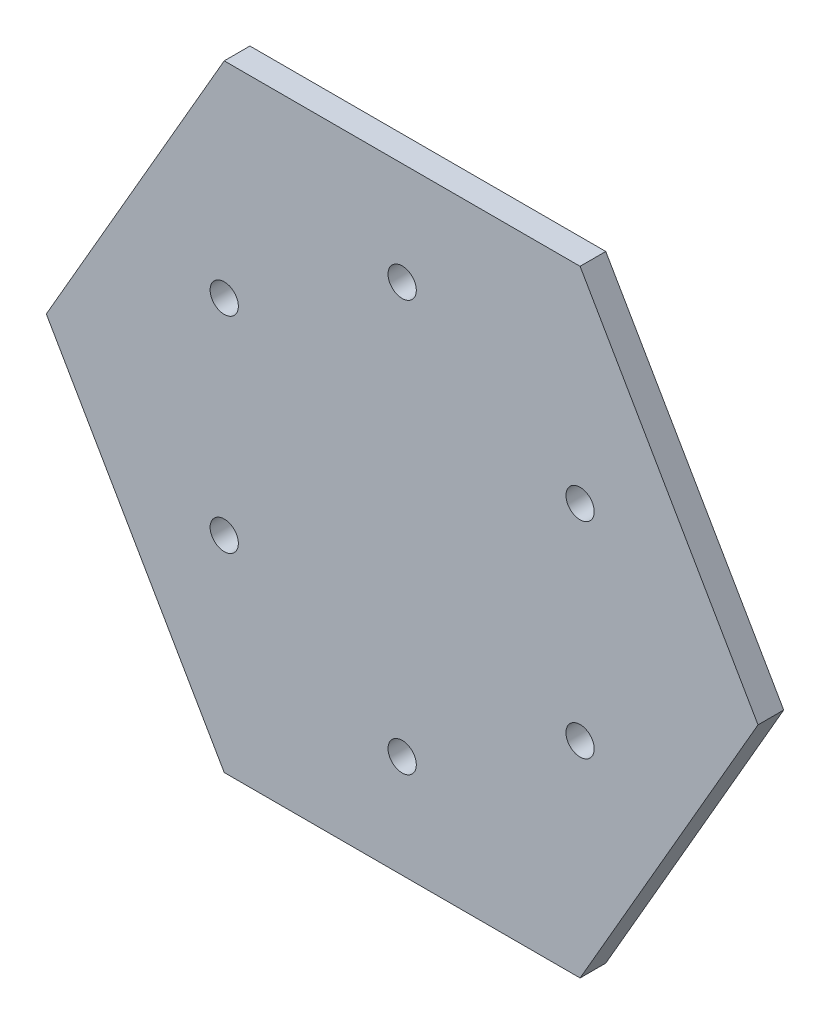
ISO-10303-21;
HEADER;
FILE_DESCRIPTION(('STEP AP214'),'2;1');
FILE_NAME('part.step','',(''),(''),'','','');
FILE_SCHEMA(('AUTOMOTIVE_DESIGN { 1 0 10303 214 1 1 1 1 }'));
ENDSEC;
DATA;
#1=APPLICATION_CONTEXT('core data for automotive mechanical design processes');
#2=APPLICATION_PROTOCOL_DEFINITION('international standard','automotive_design',2000,#1);
#3=PRODUCT_CONTEXT('',#1,'mechanical');
#4=PRODUCT('Part','Part','',(#3));
#5=PRODUCT_RELATED_PRODUCT_CATEGORY('part','',(#4));
#6=PRODUCT_DEFINITION_FORMATION('','',#4);
#7=PRODUCT_DEFINITION_CONTEXT('part definition',#1,'design');
#8=PRODUCT_DEFINITION('design','',#6,#7);
#9=PRODUCT_DEFINITION_SHAPE('','',#8);
#10=(LENGTH_UNIT() NAMED_UNIT(*) SI_UNIT(.MILLI.,.METRE.));
#11=(NAMED_UNIT(*) PLANE_ANGLE_UNIT() SI_UNIT($,.RADIAN.));
#12=(NAMED_UNIT(*) SI_UNIT($,.STERADIAN.) SOLID_ANGLE_UNIT());
#13=UNCERTAINTY_MEASURE_WITH_UNIT(LENGTH_MEASURE(1.E-05),#10,'distance_accuracy_value','');
#14=(GEOMETRIC_REPRESENTATION_CONTEXT(3) GLOBAL_UNCERTAINTY_ASSIGNED_CONTEXT((#13)) GLOBAL_UNIT_ASSIGNED_CONTEXT((#10,
#11,#12)) REPRESENTATION_CONTEXT('',''));
#15=CARTESIAN_POINT('',(0.,0.,0.));
#16=DIRECTION('',(0.,0.,1.));
#17=DIRECTION('',(1.,0.,0.));
#18=AXIS2_PLACEMENT_3D('',#15,#16,#17);
#19=CARTESIAN_POINT('',(-197.973407305123,114.3,19.05));
#20=DIRECTION('',(-0.866025403784439,0.499999999999999,0.));
#21=DIRECTION('',(-0.499999999999999,-0.866025403784439,0.));
#22=AXIS2_PLACEMENT_3D('',#19,#20,#21);
#23=PLANE('',#22);
#24=DIRECTION('',(0.499999999999999,0.866025403784439,0.));
#25=VECTOR('',#24,1.);
#26=CARTESIAN_POINT('',(-197.973407305123,114.3,0.));
#27=LINE('',#26,#25);
#28=CARTESIAN_POINT('',(-263.964543073497,-7.35522753814166E-13,0.));
#29=VERTEX_POINT('',#28);
#30=CARTESIAN_POINT('',(-131.982271536748,228.6,0.));
#31=VERTEX_POINT('',#30);
#32=EDGE_CURVE('E136',#29,#31,#27,.T.);
#33=ORIENTED_EDGE('',*,*,#32,.F.);
#34=DIRECTION('',(0.,0.,-1.));
#35=VECTOR('',#34,1.);
#36=CARTESIAN_POINT('',(-263.964543073497,-7.35522753814166E-13,19.05));
#37=LINE('',#36,#35);
#38=CARTESIAN_POINT('',(-263.964543073497,-7.35522753814166E-13,19.05));
#39=VERTEX_POINT('',#38);
#40=EDGE_CURVE('E11',#39,#29,#37,.T.);
#41=ORIENTED_EDGE('',*,*,#40,.F.);
#42=DIRECTION('',(0.499999999999999,0.866025403784439,0.));
#43=VECTOR('',#42,1.);
#44=CARTESIAN_POINT('',(-197.973407305123,114.3,19.05));
#45=LINE('',#44,#43);
#46=CARTESIAN_POINT('',(-131.982271536748,228.6,19.05));
#47=VERTEX_POINT('',#46);
#48=EDGE_CURVE('E248',#39,#47,#45,.T.);
#49=ORIENTED_EDGE('',*,*,#48,.T.);
#50=DIRECTION('',(0.,0.,-1.));
#51=VECTOR('',#50,1.);
#52=CARTESIAN_POINT('',(-131.982271536748,228.6,19.05));
#53=LINE('',#52,#51);
#54=EDGE_CURVE('E52',#47,#31,#53,.T.);
#55=ORIENTED_EDGE('',*,*,#54,.T.);
#56=EDGE_LOOP('',(#33,#41,#49,#55));
#57=FACE_BOUND('',#56,.T.);
#58=ADVANCED_FACE('F35',(#57),#23,.T.);
#59=CARTESIAN_POINT('',(-197.973407305123,-114.3,19.05));
#60=DIRECTION('',(-0.866025403784438,-0.5,0.));
#61=DIRECTION('',(0.5,-0.866025403784438,0.));
#62=AXIS2_PLACEMENT_3D('',#59,#60,#61);
#63=PLANE('',#62);
#64=DIRECTION('',(-0.5,0.866025403784438,0.));
#65=VECTOR('',#64,1.);
#66=CARTESIAN_POINT('',(-197.973407305123,-114.3,0.));
#67=LINE('',#66,#65);
#68=CARTESIAN_POINT('',(-131.982271536748,-228.6,0.));
#69=VERTEX_POINT('',#68);
#70=EDGE_CURVE('E138',#69,#29,#67,.T.);
#71=ORIENTED_EDGE('',*,*,#70,.F.);
#72=DIRECTION('',(0.,0.,-1.));
#73=VECTOR('',#72,1.);
#74=CARTESIAN_POINT('',(-131.982271536748,-228.6,19.05));
#75=LINE('',#74,#73);
#76=CARTESIAN_POINT('',(-131.982271536748,-228.6,19.05));
#77=VERTEX_POINT('',#76);
#78=EDGE_CURVE('E44',#77,#69,#75,.T.);
#79=ORIENTED_EDGE('',*,*,#78,.F.);
#80=DIRECTION('',(-0.5,0.866025403784438,0.));
#81=VECTOR('',#80,1.);
#82=CARTESIAN_POINT('',(-197.973407305123,-114.3,19.05));
#83=LINE('',#82,#81);
#84=EDGE_CURVE('E250',#77,#39,#83,.T.);
#85=ORIENTED_EDGE('',*,*,#84,.T.);
#86=ORIENTED_EDGE('',*,*,#40,.T.);
#87=EDGE_LOOP('',(#71,#79,#85,#86));
#88=FACE_BOUND('',#87,.T.);
#89=ADVANCED_FACE('F174',(#88),#63,.T.);
#90=CARTESIAN_POINT('',(0.,-228.6,19.05));
#91=DIRECTION('',(0.,-1.,0.));
#92=DIRECTION('',(0.,0.,-1.));
#93=AXIS2_PLACEMENT_3D('',#90,#91,#92);
#94=PLANE('',#93);
#95=DIRECTION('',(-1.,0.,0.));
#96=VECTOR('',#95,1.);
#97=CARTESIAN_POINT('',(0.,-228.6,0.));
#98=LINE('',#97,#96);
#99=CARTESIAN_POINT('',(131.982271536749,-228.599999999999,0.));
#100=VERTEX_POINT('',#99);
#101=EDGE_CURVE('E141',#100,#69,#98,.T.);
#102=ORIENTED_EDGE('',*,*,#101,.F.);
#103=DIRECTION('',(0.,0.,-1.));
#104=VECTOR('',#103,1.);
#105=CARTESIAN_POINT('',(131.982271536749,-228.599999999999,19.05));
#106=LINE('',#105,#104);
#107=CARTESIAN_POINT('',(131.982271536749,-228.599999999999,19.05));
#108=VERTEX_POINT('',#107);
#109=EDGE_CURVE('E99',#108,#100,#106,.T.);
#110=ORIENTED_EDGE('',*,*,#109,.F.);
#111=DIRECTION('',(-1.,0.,0.));
#112=VECTOR('',#111,1.);
#113=CARTESIAN_POINT('',(0.,-228.6,19.05));
#114=LINE('',#113,#112);
#115=EDGE_CURVE('E110',#108,#77,#114,.T.);
#116=ORIENTED_EDGE('',*,*,#115,.T.);
#117=ORIENTED_EDGE('',*,*,#78,.T.);
#118=EDGE_LOOP('',(#102,#110,#116,#117));
#119=FACE_BOUND('',#118,.T.);
#120=ADVANCED_FACE('F171',(#119),#94,.T.);
#121=CARTESIAN_POINT('',(197.973407305123,-114.3,19.05));
#122=DIRECTION('',(0.866025403784439,-0.5,0.));
#123=DIRECTION('',(0.5,0.866025403784439,0.));
#124=AXIS2_PLACEMENT_3D('',#121,#122,#123);
#125=PLANE('',#124);
#126=DIRECTION('',(-0.5,-0.866025403784439,0.));
#127=VECTOR('',#126,1.);
#128=CARTESIAN_POINT('',(197.973407305123,-114.3,0.));
#129=LINE('',#128,#127);
#130=CARTESIAN_POINT('',(263.964543073497,6.10622663543836E-13,0.));
#131=VERTEX_POINT('',#130);
#132=EDGE_CURVE('E95',#131,#100,#129,.T.);
#133=ORIENTED_EDGE('',*,*,#132,.F.);
#134=DIRECTION('',(0.,0.,-1.));
#135=VECTOR('',#134,1.);
#136=CARTESIAN_POINT('',(263.964543073497,6.10622663543836E-13,19.05));
#137=LINE('',#136,#135);
#138=CARTESIAN_POINT('',(263.964543073497,6.10622663543836E-13,19.05));
#139=VERTEX_POINT('',#138);
#140=EDGE_CURVE('E90',#139,#131,#137,.T.);
#141=ORIENTED_EDGE('',*,*,#140,.F.);
#142=DIRECTION('',(-0.5,-0.866025403784439,0.));
#143=VECTOR('',#142,1.);
#144=CARTESIAN_POINT('',(197.973407305123,-114.3,19.05));
#145=LINE('',#144,#143);
#146=EDGE_CURVE('E93',#139,#108,#145,.T.);
#147=ORIENTED_EDGE('',*,*,#146,.T.);
#148=ORIENTED_EDGE('',*,*,#109,.T.);
#149=EDGE_LOOP('',(#133,#141,#147,#148));
#150=FACE_BOUND('',#149,.T.);
#151=ADVANCED_FACE('F92',(#150),#125,.T.);
#152=CARTESIAN_POINT('',(197.973407305123,114.3,19.05));
#153=DIRECTION('',(0.866025403784439,0.5,0.));
#154=DIRECTION('',(-0.5,0.866025403784438,0.));
#155=AXIS2_PLACEMENT_3D('',#152,#153,#154);
#156=PLANE('',#155);
#157=DIRECTION('',(0.5,-0.866025403784439,0.));
#158=VECTOR('',#157,1.);
#159=CARTESIAN_POINT('',(197.973407305123,114.3,0.));
#160=LINE('',#159,#158);
#161=CARTESIAN_POINT('',(131.982271536748,228.6,0.));
#162=VERTEX_POINT('',#161);
#163=EDGE_CURVE('E145',#162,#131,#160,.T.);
#164=ORIENTED_EDGE('',*,*,#163,.F.);
#165=DIRECTION('',(0.,0.,-1.));
#166=VECTOR('',#165,1.);
#167=CARTESIAN_POINT('',(131.982271536748,228.6,19.05));
#168=LINE('',#167,#166);
#169=CARTESIAN_POINT('',(131.982271536748,228.6,19.05));
#170=VERTEX_POINT('',#169);
#171=EDGE_CURVE('E71',#170,#162,#168,.T.);
#172=ORIENTED_EDGE('',*,*,#171,.F.);
#173=DIRECTION('',(0.5,-0.866025403784439,0.));
#174=VECTOR('',#173,1.);
#175=CARTESIAN_POINT('',(197.973407305123,114.3,19.05));
#176=LINE('',#175,#174);
#177=EDGE_CURVE('E107',#170,#139,#176,.T.);
#178=ORIENTED_EDGE('',*,*,#177,.T.);
#179=ORIENTED_EDGE('',*,*,#140,.T.);
#180=EDGE_LOOP('',(#164,#172,#178,#179));
#181=FACE_BOUND('',#180,.T.);
#182=ADVANCED_FACE('F112',(#181),#156,.T.);
#183=CARTESIAN_POINT('',(0.,-152.4,19.05));
#184=DIRECTION('',(0.,0.,-1.));
#185=DIRECTION('',(-1.,0.,0.));
#186=AXIS2_PLACEMENT_3D('',#183,#184,#185);
#187=CYLINDRICAL_SURFACE('',#186,10.4775);
#188=CARTESIAN_POINT('',(0.,-152.4,19.05));
#189=DIRECTION('',(0.,0.,1.));
#190=DIRECTION('',(1.,0.,0.));
#191=AXIS2_PLACEMENT_3D('',#188,#189,#190);
#192=CIRCLE('',#191,10.4775);
#193=CARTESIAN_POINT('',(-10.4775,-152.4,19.05));
#194=VERTEX_POINT('',#193);
#195=EDGE_CURVE('E127',#194,#194,#192,.T.);
#196=CARTESIAN_POINT('',(0.,-152.4,0.));
#197=DIRECTION('',(0.,0.,1.));
#198=DIRECTION('',(1.,0.,0.));
#199=AXIS2_PLACEMENT_3D('',#196,#197,#198);
#200=CIRCLE('',#199,10.4775);
#201=CARTESIAN_POINT('',(-10.4775,-152.4,0.));
#202=VERTEX_POINT('',#201);
#203=EDGE_CURVE('E159',#202,#202,#200,.T.);
#204=CARTESIAN_POINT('',(-10.4775,-152.4,19.05));
#205=CARTESIAN_POINT('',(-10.4775,-152.4,18.8515625));
#206=CARTESIAN_POINT('',(-10.4775,-152.4,18.653125));
#207=CARTESIAN_POINT('',(-10.4775,-152.4,18.25625));
#208=CARTESIAN_POINT('',(-10.4775,-152.4,18.0578125));
#209=CARTESIAN_POINT('',(-10.4775,-152.4,17.6609375));
#210=CARTESIAN_POINT('',(-10.4775,-152.4,17.4625));
#211=CARTESIAN_POINT('',(-10.4775,-152.4,17.065625));
#212=CARTESIAN_POINT('',(-10.4775,-152.4,16.8671875));
#213=CARTESIAN_POINT('',(-10.4775,-152.4,16.4703125));
#214=CARTESIAN_POINT('',(-10.4775,-152.4,16.271875));
#215=CARTESIAN_POINT('',(-10.4775,-152.4,15.875));
#216=CARTESIAN_POINT('',(-10.4775,-152.4,15.6765625));
#217=CARTESIAN_POINT('',(-10.4775,-152.4,15.2796875));
#218=CARTESIAN_POINT('',(-10.4775,-152.4,15.08125));
#219=CARTESIAN_POINT('',(-10.4775,-152.4,14.684375));
#220=CARTESIAN_POINT('',(-10.4775,-152.4,14.4859375));
#221=CARTESIAN_POINT('',(-10.4775,-152.4,14.0890625));
#222=CARTESIAN_POINT('',(-10.4775,-152.4,13.890625));
#223=CARTESIAN_POINT('',(-10.4775,-152.4,13.49375));
#224=CARTESIAN_POINT('',(-10.4775,-152.4,13.2953125));
#225=CARTESIAN_POINT('',(-10.4775,-152.4,12.8984375));
#226=CARTESIAN_POINT('',(-10.4775,-152.4,12.7));
#227=CARTESIAN_POINT('',(-10.4775,-152.4,12.303125));
#228=CARTESIAN_POINT('',(-10.4775,-152.4,12.1046875));
#229=CARTESIAN_POINT('',(-10.4775,-152.4,11.7078125));
#230=CARTESIAN_POINT('',(-10.4775,-152.4,11.509375));
#231=CARTESIAN_POINT('',(-10.4775,-152.4,11.1125));
#232=CARTESIAN_POINT('',(-10.4775,-152.4,10.9140625));
#233=CARTESIAN_POINT('',(-10.4775,-152.4,10.5171875));
#234=CARTESIAN_POINT('',(-10.4775,-152.4,10.31875));
#235=CARTESIAN_POINT('',(-10.4775,-152.4,9.921875));
#236=CARTESIAN_POINT('',(-10.4775,-152.4,9.7234375));
#237=CARTESIAN_POINT('',(-10.4775,-152.4,9.3265625));
#238=CARTESIAN_POINT('',(-10.4775,-152.4,9.128125));
#239=CARTESIAN_POINT('',(-10.4775,-152.4,8.73125));
#240=CARTESIAN_POINT('',(-10.4775,-152.4,8.5328125));
#241=CARTESIAN_POINT('',(-10.4775,-152.4,8.1359375));
#242=CARTESIAN_POINT('',(-10.4775,-152.4,7.9375));
#243=CARTESIAN_POINT('',(-10.4775,-152.4,7.540625));
#244=CARTESIAN_POINT('',(-10.4775,-152.4,7.3421875));
#245=CARTESIAN_POINT('',(-10.4775,-152.4,6.9453125));
#246=CARTESIAN_POINT('',(-10.4775,-152.4,6.746875));
#247=CARTESIAN_POINT('',(-10.4775,-152.4,6.35));
#248=CARTESIAN_POINT('',(-10.4775,-152.4,6.1515625));
#249=CARTESIAN_POINT('',(-10.4775,-152.4,5.7546875));
#250=CARTESIAN_POINT('',(-10.4775,-152.4,5.55625));
#251=CARTESIAN_POINT('',(-10.4775,-152.4,5.159375));
#252=CARTESIAN_POINT('',(-10.4775,-152.4,4.9609375));
#253=CARTESIAN_POINT('',(-10.4775,-152.4,4.5640625));
#254=CARTESIAN_POINT('',(-10.4775,-152.4,4.365625));
#255=CARTESIAN_POINT('',(-10.4775,-152.4,3.96875));
#256=CARTESIAN_POINT('',(-10.4775,-152.4,3.7703125));
#257=CARTESIAN_POINT('',(-10.4775,-152.4,3.3734375));
#258=CARTESIAN_POINT('',(-10.4775,-152.4,3.175));
#259=CARTESIAN_POINT('',(-10.4775,-152.4,2.778125));
#260=CARTESIAN_POINT('',(-10.4775,-152.4,2.5796875));
#261=CARTESIAN_POINT('',(-10.4775,-152.4,2.1828125));
#262=CARTESIAN_POINT('',(-10.4775,-152.4,1.984375));
#263=CARTESIAN_POINT('',(-10.4775,-152.4,1.5875));
#264=CARTESIAN_POINT('',(-10.4775,-152.4,1.3890625));
#265=CARTESIAN_POINT('',(-10.4775,-152.4,0.992187500000001));
#266=CARTESIAN_POINT('',(-10.4775,-152.4,0.793750000000001));
#267=CARTESIAN_POINT('',(-10.4775,-152.4,0.396875));
#268=CARTESIAN_POINT('',(-10.4775,-152.4,0.1984375));
#269=CARTESIAN_POINT('',(-10.4775,-152.4,0.));
#270=B_SPLINE_CURVE_WITH_KNOTS('',3,(#204,#205,#206,#207,#208,#209,#210,#211,#212,#213,#214,
#215,#216,#217,#218,#219,#220,#221,#222,#223,#224,#225,#226,#227,#228,#229,#230,#231,#232,#233,
#234,#235,#236,#237,#238,#239,#240,#241,#242,#243,#244,#245,#246,#247,#248,#249,#250,#251,#252,
#253,#254,#255,#256,#257,#258,#259,#260,#261,#262,#263,#264,#265,#266,#267,#268,#269),
.UNSPECIFIED.,.F.,.F.,(4,2,2,2,2,2,2,2,2,2,2,2,2,2,2,2,2,2,2,2,2,2,2,2,2,2,2,2,2,2,2,2,4),(0.,
0.595312499999997,1.190625,1.7859375,2.38125,2.9765625,3.571875,4.1671875,4.7625,5.3578125,
5.953125,6.5484375,7.14375,7.7390625,8.334375,8.9296875,9.525,10.1203125,10.715625,11.3109375,
11.90625,12.5015625,13.096875,13.6921875,14.2875,14.8828125,15.478125,16.0734375,16.66875,
17.2640625,17.859375,18.4546875,19.05),.UNSPECIFIED.);
#271=EDGE_CURVE('BSEAM202',#194,#202,#270,.T.);
#272=ORIENTED_EDGE('',*,*,#195,.T.);
#273=ORIENTED_EDGE('',*,*,#203,.F.);
#274=ORIENTED_EDGE('',*,*,#271,.T.);
#275=ORIENTED_EDGE('',*,*,#271,.F.);
#276=EDGE_LOOP('',(#272,#274,#273,#275));
#277=FACE_BOUND('',#276,.T.);
#278=ADVANCED_FACE('F202',(#277),#187,.F.);
#279=CARTESIAN_POINT('',(131.982271536748,76.2,19.05));
#280=DIRECTION('',(0.,0.,-1.));
#281=DIRECTION('',(-1.,0.,0.));
#282=AXIS2_PLACEMENT_3D('',#279,#280,#281);
#283=CYLINDRICAL_SURFACE('',#282,10.4775);
#284=CARTESIAN_POINT('',(131.982271536748,76.2,19.05));
#285=DIRECTION('',(0.,0.,1.));
#286=DIRECTION('',(1.,0.,0.));
#287=AXIS2_PLACEMENT_3D('',#284,#285,#286);
#288=CIRCLE('',#287,10.4775);
#289=CARTESIAN_POINT('',(121.504771536748,76.2,19.05));
#290=VERTEX_POINT('',#289);
#291=EDGE_CURVE('E124',#290,#290,#288,.T.);
#292=CARTESIAN_POINT('',(131.982271536748,76.2,0.));
#293=DIRECTION('',(0.,0.,1.));
#294=DIRECTION('',(1.,0.,0.));
#295=AXIS2_PLACEMENT_3D('',#292,#293,#294);
#296=CIRCLE('',#295,10.4775);
#297=CARTESIAN_POINT('',(121.504771536748,76.2,0.));
#298=VERTEX_POINT('',#297);
#299=EDGE_CURVE('E156',#298,#298,#296,.T.);
#300=CARTESIAN_POINT('',(121.504771536748,76.2,19.05));
#301=CARTESIAN_POINT('',(121.504771536748,76.2,18.8515625));
#302=CARTESIAN_POINT('',(121.504771536748,76.2,18.653125));
#303=CARTESIAN_POINT('',(121.504771536748,76.2,18.25625));
#304=CARTESIAN_POINT('',(121.504771536748,76.2,18.0578125));
#305=CARTESIAN_POINT('',(121.504771536748,76.2,17.6609375));
#306=CARTESIAN_POINT('',(121.504771536748,76.2,17.4625));
#307=CARTESIAN_POINT('',(121.504771536748,76.2,17.065625));
#308=CARTESIAN_POINT('',(121.504771536748,76.2,16.8671875));
#309=CARTESIAN_POINT('',(121.504771536748,76.2,16.4703125));
#310=CARTESIAN_POINT('',(121.504771536748,76.2,16.271875));
#311=CARTESIAN_POINT('',(121.504771536748,76.2,15.875));
#312=CARTESIAN_POINT('',(121.504771536748,76.2,15.6765625));
#313=CARTESIAN_POINT('',(121.504771536748,76.2,15.2796875));
#314=CARTESIAN_POINT('',(121.504771536748,76.2,15.08125));
#315=CARTESIAN_POINT('',(121.504771536748,76.2,14.684375));
#316=CARTESIAN_POINT('',(121.504771536748,76.2,14.4859375));
#317=CARTESIAN_POINT('',(121.504771536748,76.2,14.0890625));
#318=CARTESIAN_POINT('',(121.504771536748,76.2,13.890625));
#319=CARTESIAN_POINT('',(121.504771536748,76.2,13.49375));
#320=CARTESIAN_POINT('',(121.504771536748,76.2,13.2953125));
#321=CARTESIAN_POINT('',(121.504771536748,76.2,12.8984375));
#322=CARTESIAN_POINT('',(121.504771536748,76.2,12.7));
#323=CARTESIAN_POINT('',(121.504771536748,76.2,12.303125));
#324=CARTESIAN_POINT('',(121.504771536748,76.2,12.1046875));
#325=CARTESIAN_POINT('',(121.504771536748,76.2,11.7078125));
#326=CARTESIAN_POINT('',(121.504771536748,76.2,11.509375));
#327=CARTESIAN_POINT('',(121.504771536748,76.2,11.1125));
#328=CARTESIAN_POINT('',(121.504771536748,76.2,10.9140625));
#329=CARTESIAN_POINT('',(121.504771536748,76.2,10.5171875));
#330=CARTESIAN_POINT('',(121.504771536748,76.2,10.31875));
#331=CARTESIAN_POINT('',(121.504771536748,76.2,9.921875));
#332=CARTESIAN_POINT('',(121.504771536748,76.2,9.7234375));
#333=CARTESIAN_POINT('',(121.504771536748,76.2,9.3265625));
#334=CARTESIAN_POINT('',(121.504771536748,76.2,9.128125));
#335=CARTESIAN_POINT('',(121.504771536748,76.2,8.73125));
#336=CARTESIAN_POINT('',(121.504771536748,76.2,8.5328125));
#337=CARTESIAN_POINT('',(121.504771536748,76.2,8.1359375));
#338=CARTESIAN_POINT('',(121.504771536748,76.2,7.9375));
#339=CARTESIAN_POINT('',(121.504771536748,76.2,7.540625));
#340=CARTESIAN_POINT('',(121.504771536748,76.2,7.3421875));
#341=CARTESIAN_POINT('',(121.504771536748,76.2,6.9453125));
#342=CARTESIAN_POINT('',(121.504771536748,76.2,6.746875));
#343=CARTESIAN_POINT('',(121.504771536748,76.2,6.35));
#344=CARTESIAN_POINT('',(121.504771536748,76.2,6.1515625));
#345=CARTESIAN_POINT('',(121.504771536748,76.2,5.7546875));
#346=CARTESIAN_POINT('',(121.504771536748,76.2,5.55625));
#347=CARTESIAN_POINT('',(121.504771536748,76.2,5.159375));
#348=CARTESIAN_POINT('',(121.504771536748,76.2,4.9609375));
#349=CARTESIAN_POINT('',(121.504771536748,76.2,4.5640625));
#350=CARTESIAN_POINT('',(121.504771536748,76.2,4.365625));
#351=CARTESIAN_POINT('',(121.504771536748,76.2,3.96875));
#352=CARTESIAN_POINT('',(121.504771536748,76.2,3.7703125));
#353=CARTESIAN_POINT('',(121.504771536748,76.2,3.3734375));
#354=CARTESIAN_POINT('',(121.504771536748,76.2,3.175));
#355=CARTESIAN_POINT('',(121.504771536748,76.2,2.778125));
#356=CARTESIAN_POINT('',(121.504771536748,76.2,2.5796875));
#357=CARTESIAN_POINT('',(121.504771536748,76.2,2.1828125));
#358=CARTESIAN_POINT('',(121.504771536748,76.2,1.984375));
#359=CARTESIAN_POINT('',(121.504771536748,76.2,1.5875));
#360=CARTESIAN_POINT('',(121.504771536748,76.2,1.3890625));
#361=CARTESIAN_POINT('',(121.504771536748,76.2,0.992187500000001));
#362=CARTESIAN_POINT('',(121.504771536748,76.2,0.793750000000001));
#363=CARTESIAN_POINT('',(121.504771536748,76.2,0.396875));
#364=CARTESIAN_POINT('',(121.504771536748,76.2,0.1984375));
#365=CARTESIAN_POINT('',(121.504771536748,76.2,0.));
#366=B_SPLINE_CURVE_WITH_KNOTS('',3,(#300,#301,#302,#303,#304,#305,#306,#307,#308,#309,#310,
#311,#312,#313,#314,#315,#316,#317,#318,#319,#320,#321,#322,#323,#324,#325,#326,#327,#328,#329,
#330,#331,#332,#333,#334,#335,#336,#337,#338,#339,#340,#341,#342,#343,#344,#345,#346,#347,#348,
#349,#350,#351,#352,#353,#354,#355,#356,#357,#358,#359,#360,#361,#362,#363,#364,#365),
.UNSPECIFIED.,.F.,.F.,(4,2,2,2,2,2,2,2,2,2,2,2,2,2,2,2,2,2,2,2,2,2,2,2,2,2,2,2,2,2,2,2,4),(0.,
0.595312499999997,1.190625,1.7859375,2.38125,2.9765625,3.571875,4.1671875,4.7625,5.3578125,
5.953125,6.5484375,7.14375,7.7390625,8.334375,8.9296875,9.525,10.1203125,10.715625,11.3109375,
11.90625,12.5015625,13.096875,13.6921875,14.2875,14.8828125,15.478125,16.0734375,16.66875,
17.2640625,17.859375,18.4546875,19.05),.UNSPECIFIED.);
#367=EDGE_CURVE('BSEAM206',#290,#298,#366,.T.);
#368=ORIENTED_EDGE('',*,*,#291,.T.);
#369=ORIENTED_EDGE('',*,*,#299,.F.);
#370=ORIENTED_EDGE('',*,*,#367,.T.);
#371=ORIENTED_EDGE('',*,*,#367,.F.);
#372=EDGE_LOOP('',(#368,#370,#369,#371));
#373=FACE_BOUND('',#372,.T.);
#374=ADVANCED_FACE('F206',(#373),#283,.F.);
#375=CARTESIAN_POINT('',(-131.982271536748,-76.2000000000001,19.05));
#376=DIRECTION('',(0.,0.,-1.));
#377=DIRECTION('',(-1.,0.,0.));
#378=AXIS2_PLACEMENT_3D('',#375,#376,#377);
#379=CYLINDRICAL_SURFACE('',#378,10.4775);
#380=CARTESIAN_POINT('',(-131.982271536748,-76.2000000000001,19.05));
#381=DIRECTION('',(0.,0.,1.));
#382=DIRECTION('',(1.,0.,0.));
#383=AXIS2_PLACEMENT_3D('',#380,#381,#382);
#384=CIRCLE('',#383,10.4775);
#385=CARTESIAN_POINT('',(-142.459771536748,-76.2000000000001,19.05));
#386=VERTEX_POINT('',#385);
#387=EDGE_CURVE('E121',#386,#386,#384,.T.);
#388=CARTESIAN_POINT('',(-131.982271536748,-76.2000000000001,0.));
#389=DIRECTION('',(0.,0.,1.));
#390=DIRECTION('',(1.,0.,0.));
#391=AXIS2_PLACEMENT_3D('',#388,#389,#390);
#392=CIRCLE('',#391,10.4775);
#393=CARTESIAN_POINT('',(-142.459771536748,-76.2000000000001,0.));
#394=VERTEX_POINT('',#393);
#395=EDGE_CURVE('E153',#394,#394,#392,.T.);
#396=CARTESIAN_POINT('',(-142.459771536748,-76.2000000000001,19.05));
#397=CARTESIAN_POINT('',(-142.459771536748,-76.2000000000001,18.8515625));
#398=CARTESIAN_POINT('',(-142.459771536748,-76.2000000000001,18.653125));
#399=CARTESIAN_POINT('',(-142.459771536748,-76.2000000000001,18.25625));
#400=CARTESIAN_POINT('',(-142.459771536748,-76.2000000000001,18.0578125));
#401=CARTESIAN_POINT('',(-142.459771536748,-76.2000000000001,17.6609375));
#402=CARTESIAN_POINT('',(-142.459771536748,-76.2000000000001,17.4625));
#403=CARTESIAN_POINT('',(-142.459771536748,-76.2000000000001,17.065625));
#404=CARTESIAN_POINT('',(-142.459771536748,-76.2000000000001,16.8671875));
#405=CARTESIAN_POINT('',(-142.459771536748,-76.2000000000001,16.4703125));
#406=CARTESIAN_POINT('',(-142.459771536748,-76.2000000000001,16.271875));
#407=CARTESIAN_POINT('',(-142.459771536748,-76.2000000000001,15.875));
#408=CARTESIAN_POINT('',(-142.459771536748,-76.2000000000001,15.6765625));
#409=CARTESIAN_POINT('',(-142.459771536748,-76.2000000000001,15.2796875));
#410=CARTESIAN_POINT('',(-142.459771536748,-76.2000000000001,15.08125));
#411=CARTESIAN_POINT('',(-142.459771536748,-76.2000000000001,14.684375));
#412=CARTESIAN_POINT('',(-142.459771536748,-76.2000000000001,14.4859375));
#413=CARTESIAN_POINT('',(-142.459771536748,-76.2000000000001,14.0890625));
#414=CARTESIAN_POINT('',(-142.459771536748,-76.2000000000001,13.890625));
#415=CARTESIAN_POINT('',(-142.459771536748,-76.2000000000001,13.49375));
#416=CARTESIAN_POINT('',(-142.459771536748,-76.2000000000001,13.2953125));
#417=CARTESIAN_POINT('',(-142.459771536748,-76.2000000000001,12.8984375));
#418=CARTESIAN_POINT('',(-142.459771536748,-76.2000000000001,12.7));
#419=CARTESIAN_POINT('',(-142.459771536748,-76.2000000000001,12.303125));
#420=CARTESIAN_POINT('',(-142.459771536748,-76.2000000000001,12.1046875));
#421=CARTESIAN_POINT('',(-142.459771536748,-76.2000000000001,11.7078125));
#422=CARTESIAN_POINT('',(-142.459771536748,-76.2000000000001,11.509375));
#423=CARTESIAN_POINT('',(-142.459771536748,-76.2000000000001,11.1125));
#424=CARTESIAN_POINT('',(-142.459771536748,-76.2000000000001,10.9140625));
#425=CARTESIAN_POINT('',(-142.459771536748,-76.2000000000001,10.5171875));
#426=CARTESIAN_POINT('',(-142.459771536748,-76.2000000000001,10.31875));
#427=CARTESIAN_POINT('',(-142.459771536748,-76.2000000000001,9.921875));
#428=CARTESIAN_POINT('',(-142.459771536748,-76.2000000000001,9.7234375));
#429=CARTESIAN_POINT('',(-142.459771536748,-76.2000000000001,9.3265625));
#430=CARTESIAN_POINT('',(-142.459771536748,-76.2000000000001,9.128125));
#431=CARTESIAN_POINT('',(-142.459771536748,-76.2000000000001,8.73125));
#432=CARTESIAN_POINT('',(-142.459771536748,-76.2000000000001,8.5328125));
#433=CARTESIAN_POINT('',(-142.459771536748,-76.2000000000001,8.1359375));
#434=CARTESIAN_POINT('',(-142.459771536748,-76.2000000000001,7.9375));
#435=CARTESIAN_POINT('',(-142.459771536748,-76.2000000000001,7.540625));
#436=CARTESIAN_POINT('',(-142.459771536748,-76.2000000000001,7.3421875));
#437=CARTESIAN_POINT('',(-142.459771536748,-76.2000000000001,6.9453125));
#438=CARTESIAN_POINT('',(-142.459771536748,-76.2000000000001,6.746875));
#439=CARTESIAN_POINT('',(-142.459771536748,-76.2000000000001,6.35));
#440=CARTESIAN_POINT('',(-142.459771536748,-76.2000000000001,6.1515625));
#441=CARTESIAN_POINT('',(-142.459771536748,-76.2000000000001,5.7546875));
#442=CARTESIAN_POINT('',(-142.459771536748,-76.2000000000001,5.55625));
#443=CARTESIAN_POINT('',(-142.459771536748,-76.2000000000001,5.159375));
#444=CARTESIAN_POINT('',(-142.459771536748,-76.2000000000001,4.9609375));
#445=CARTESIAN_POINT('',(-142.459771536748,-76.2000000000001,4.5640625));
#446=CARTESIAN_POINT('',(-142.459771536748,-76.2000000000001,4.365625));
#447=CARTESIAN_POINT('',(-142.459771536748,-76.2000000000001,3.96875));
#448=CARTESIAN_POINT('',(-142.459771536748,-76.2000000000001,3.7703125));
#449=CARTESIAN_POINT('',(-142.459771536748,-76.2000000000001,3.3734375));
#450=CARTESIAN_POINT('',(-142.459771536748,-76.2000000000001,3.175));
#451=CARTESIAN_POINT('',(-142.459771536748,-76.2000000000001,2.778125));
#452=CARTESIAN_POINT('',(-142.459771536748,-76.2000000000001,2.5796875));
#453=CARTESIAN_POINT('',(-142.459771536748,-76.2000000000001,2.1828125));
#454=CARTESIAN_POINT('',(-142.459771536748,-76.2000000000001,1.984375));
#455=CARTESIAN_POINT('',(-142.459771536748,-76.2000000000001,1.5875));
#456=CARTESIAN_POINT('',(-142.459771536748,-76.2000000000001,1.3890625));
#457=CARTESIAN_POINT('',(-142.459771536748,-76.2000000000001,0.992187500000001));
#458=CARTESIAN_POINT('',(-142.459771536748,-76.2000000000001,0.793750000000001));
#459=CARTESIAN_POINT('',(-142.459771536748,-76.2000000000001,0.396875));
#460=CARTESIAN_POINT('',(-142.459771536748,-76.2000000000001,0.1984375));
#461=CARTESIAN_POINT('',(-142.459771536748,-76.2000000000001,0.));
#462=B_SPLINE_CURVE_WITH_KNOTS('',3,(#396,#397,#398,#399,#400,#401,#402,#403,#404,#405,#406,
#407,#408,#409,#410,#411,#412,#413,#414,#415,#416,#417,#418,#419,#420,#421,#422,#423,#424,#425,
#426,#427,#428,#429,#430,#431,#432,#433,#434,#435,#436,#437,#438,#439,#440,#441,#442,#443,#444,
#445,#446,#447,#448,#449,#450,#451,#452,#453,#454,#455,#456,#457,#458,#459,#460,#461),
.UNSPECIFIED.,.F.,.F.,(4,2,2,2,2,2,2,2,2,2,2,2,2,2,2,2,2,2,2,2,2,2,2,2,2,2,2,2,2,2,2,2,4),(0.,
0.595312499999997,1.190625,1.7859375,2.38125,2.9765625,3.571875,4.1671875,4.7625,5.3578125,
5.953125,6.5484375,7.14375,7.7390625,8.334375,8.9296875,9.525,10.1203125,10.715625,11.3109375,
11.90625,12.5015625,13.096875,13.6921875,14.2875,14.8828125,15.478125,16.0734375,16.66875,
17.2640625,17.859375,18.4546875,19.05),.UNSPECIFIED.);
#463=EDGE_CURVE('BSEAM188',#386,#394,#462,.T.);
#464=ORIENTED_EDGE('',*,*,#387,.T.);
#465=ORIENTED_EDGE('',*,*,#395,.F.);
#466=ORIENTED_EDGE('',*,*,#463,.T.);
#467=ORIENTED_EDGE('',*,*,#463,.F.);
#468=EDGE_LOOP('',(#464,#466,#465,#467));
#469=FACE_BOUND('',#468,.T.);
#470=ADVANCED_FACE('F188',(#469),#379,.F.);
#471=CARTESIAN_POINT('',(0.,152.4,19.05));
#472=DIRECTION('',(0.,0.,-1.));
#473=DIRECTION('',(-1.,0.,0.));
#474=AXIS2_PLACEMENT_3D('',#471,#472,#473);
#475=CYLINDRICAL_SURFACE('',#474,10.4775);
#476=CARTESIAN_POINT('',(0.,152.4,19.05));
#477=DIRECTION('',(0.,0.,1.));
#478=DIRECTION('',(1.,0.,0.));
#479=AXIS2_PLACEMENT_3D('',#476,#477,#478);
#480=CIRCLE('',#479,10.4775);
#481=CARTESIAN_POINT('',(-10.4775,152.4,19.05));
#482=VERTEX_POINT('',#481);
#483=EDGE_CURVE('E115',#482,#482,#480,.T.);
#484=CARTESIAN_POINT('',(0.,152.4,0.));
#485=DIRECTION('',(0.,0.,1.));
#486=DIRECTION('',(1.,0.,0.));
#487=AXIS2_PLACEMENT_3D('',#484,#485,#486);
#488=CIRCLE('',#487,10.4775);
#489=CARTESIAN_POINT('',(-10.4775,152.4,0.));
#490=VERTEX_POINT('',#489);
#491=EDGE_CURVE('E150',#490,#490,#488,.T.);
#492=CARTESIAN_POINT('',(-10.4775,152.4,19.05));
#493=CARTESIAN_POINT('',(-10.4775,152.4,18.8515625));
#494=CARTESIAN_POINT('',(-10.4775,152.4,18.653125));
#495=CARTESIAN_POINT('',(-10.4775,152.4,18.25625));
#496=CARTESIAN_POINT('',(-10.4775,152.4,18.0578125));
#497=CARTESIAN_POINT('',(-10.4775,152.4,17.6609375));
#498=CARTESIAN_POINT('',(-10.4775,152.4,17.4625));
#499=CARTESIAN_POINT('',(-10.4775,152.4,17.065625));
#500=CARTESIAN_POINT('',(-10.4775,152.4,16.8671875));
#501=CARTESIAN_POINT('',(-10.4775,152.4,16.4703125));
#502=CARTESIAN_POINT('',(-10.4775,152.4,16.271875));
#503=CARTESIAN_POINT('',(-10.4775,152.4,15.875));
#504=CARTESIAN_POINT('',(-10.4775,152.4,15.6765625));
#505=CARTESIAN_POINT('',(-10.4775,152.4,15.2796875));
#506=CARTESIAN_POINT('',(-10.4775,152.4,15.08125));
#507=CARTESIAN_POINT('',(-10.4775,152.4,14.684375));
#508=CARTESIAN_POINT('',(-10.4775,152.4,14.4859375));
#509=CARTESIAN_POINT('',(-10.4775,152.4,14.0890625));
#510=CARTESIAN_POINT('',(-10.4775,152.4,13.890625));
#511=CARTESIAN_POINT('',(-10.4775,152.4,13.49375));
#512=CARTESIAN_POINT('',(-10.4775,152.4,13.2953125));
#513=CARTESIAN_POINT('',(-10.4775,152.4,12.8984375));
#514=CARTESIAN_POINT('',(-10.4775,152.4,12.7));
#515=CARTESIAN_POINT('',(-10.4775,152.4,12.303125));
#516=CARTESIAN_POINT('',(-10.4775,152.4,12.1046875));
#517=CARTESIAN_POINT('',(-10.4775,152.4,11.7078125));
#518=CARTESIAN_POINT('',(-10.4775,152.4,11.509375));
#519=CARTESIAN_POINT('',(-10.4775,152.4,11.1125));
#520=CARTESIAN_POINT('',(-10.4775,152.4,10.9140625));
#521=CARTESIAN_POINT('',(-10.4775,152.4,10.5171875));
#522=CARTESIAN_POINT('',(-10.4775,152.4,10.31875));
#523=CARTESIAN_POINT('',(-10.4775,152.4,9.921875));
#524=CARTESIAN_POINT('',(-10.4775,152.4,9.7234375));
#525=CARTESIAN_POINT('',(-10.4775,152.4,9.3265625));
#526=CARTESIAN_POINT('',(-10.4775,152.4,9.128125));
#527=CARTESIAN_POINT('',(-10.4775,152.4,8.73125));
#528=CARTESIAN_POINT('',(-10.4775,152.4,8.5328125));
#529=CARTESIAN_POINT('',(-10.4775,152.4,8.1359375));
#530=CARTESIAN_POINT('',(-10.4775,152.4,7.9375));
#531=CARTESIAN_POINT('',(-10.4775,152.4,7.540625));
#532=CARTESIAN_POINT('',(-10.4775,152.4,7.3421875));
#533=CARTESIAN_POINT('',(-10.4775,152.4,6.9453125));
#534=CARTESIAN_POINT('',(-10.4775,152.4,6.746875));
#535=CARTESIAN_POINT('',(-10.4775,152.4,6.35));
#536=CARTESIAN_POINT('',(-10.4775,152.4,6.1515625));
#537=CARTESIAN_POINT('',(-10.4775,152.4,5.7546875));
#538=CARTESIAN_POINT('',(-10.4775,152.4,5.55625));
#539=CARTESIAN_POINT('',(-10.4775,152.4,5.159375));
#540=CARTESIAN_POINT('',(-10.4775,152.4,4.9609375));
#541=CARTESIAN_POINT('',(-10.4775,152.4,4.5640625));
#542=CARTESIAN_POINT('',(-10.4775,152.4,4.365625));
#543=CARTESIAN_POINT('',(-10.4775,152.4,3.96875));
#544=CARTESIAN_POINT('',(-10.4775,152.4,3.7703125));
#545=CARTESIAN_POINT('',(-10.4775,152.4,3.3734375));
#546=CARTESIAN_POINT('',(-10.4775,152.4,3.175));
#547=CARTESIAN_POINT('',(-10.4775,152.4,2.778125));
#548=CARTESIAN_POINT('',(-10.4775,152.4,2.5796875));
#549=CARTESIAN_POINT('',(-10.4775,152.4,2.1828125));
#550=CARTESIAN_POINT('',(-10.4775,152.4,1.984375));
#551=CARTESIAN_POINT('',(-10.4775,152.4,1.5875));
#552=CARTESIAN_POINT('',(-10.4775,152.4,1.3890625));
#553=CARTESIAN_POINT('',(-10.4775,152.4,0.992187500000001));
#554=CARTESIAN_POINT('',(-10.4775,152.4,0.793750000000001));
#555=CARTESIAN_POINT('',(-10.4775,152.4,0.396875));
#556=CARTESIAN_POINT('',(-10.4775,152.4,0.1984375));
#557=CARTESIAN_POINT('',(-10.4775,152.4,0.));
#558=B_SPLINE_CURVE_WITH_KNOTS('',3,(#492,#493,#494,#495,#496,#497,#498,#499,#500,#501,#502,
#503,#504,#505,#506,#507,#508,#509,#510,#511,#512,#513,#514,#515,#516,#517,#518,#519,#520,#521,
#522,#523,#524,#525,#526,#527,#528,#529,#530,#531,#532,#533,#534,#535,#536,#537,#538,#539,#540,
#541,#542,#543,#544,#545,#546,#547,#548,#549,#550,#551,#552,#553,#554,#555,#556,#557),
.UNSPECIFIED.,.F.,.F.,(4,2,2,2,2,2,2,2,2,2,2,2,2,2,2,2,2,2,2,2,2,2,2,2,2,2,2,2,2,2,2,2,4),(0.,
0.595312499999997,1.190625,1.7859375,2.38125,2.9765625,3.571875,4.1671875,4.7625,5.3578125,
5.953125,6.5484375,7.14375,7.7390625,8.334375,8.9296875,9.525,10.1203125,10.715625,11.3109375,
11.90625,12.5015625,13.096875,13.6921875,14.2875,14.8828125,15.478125,16.0734375,16.66875,
17.2640625,17.859375,18.4546875,19.05),.UNSPECIFIED.);
#559=EDGE_CURVE('BSEAM180',#482,#490,#558,.T.);
#560=ORIENTED_EDGE('',*,*,#483,.T.);
#561=ORIENTED_EDGE('',*,*,#491,.F.);
#562=ORIENTED_EDGE('',*,*,#559,.T.);
#563=ORIENTED_EDGE('',*,*,#559,.F.);
#564=EDGE_LOOP('',(#560,#562,#561,#563));
#565=FACE_BOUND('',#564,.T.);
#566=ADVANCED_FACE('F180',(#565),#475,.F.);
#567=CARTESIAN_POINT('',(0.,228.6,19.05));
#568=DIRECTION('',(0.,1.,0.));
#569=DIRECTION('',(-1.,0.,0.));
#570=AXIS2_PLACEMENT_3D('',#567,#568,#569);
#571=PLANE('',#570);
#572=DIRECTION('',(1.,0.,0.));
#573=VECTOR('',#572,1.);
#574=CARTESIAN_POINT('',(0.,228.6,0.));
#575=LINE('',#574,#573);
#576=EDGE_CURVE('E147',#31,#162,#575,.T.);
#577=ORIENTED_EDGE('',*,*,#576,.F.);
#578=ORIENTED_EDGE('',*,*,#54,.F.);
#579=DIRECTION('',(1.,0.,0.));
#580=VECTOR('',#579,1.);
#581=CARTESIAN_POINT('',(0.,228.6,19.05));
#582=LINE('',#581,#580);
#583=EDGE_CURVE('E113',#47,#170,#582,.T.);
#584=ORIENTED_EDGE('',*,*,#583,.T.);
#585=ORIENTED_EDGE('',*,*,#171,.T.);
#586=EDGE_LOOP('',(#577,#578,#584,#585));
#587=FACE_BOUND('',#586,.T.);
#588=ADVANCED_FACE('F178',(#587),#571,.T.);
#589=CARTESIAN_POINT('',(-131.982271536749,76.1999999999999,19.05));
#590=DIRECTION('',(0.,0.,-1.));
#591=DIRECTION('',(-1.,0.,0.));
#592=AXIS2_PLACEMENT_3D('',#589,#590,#591);
#593=CYLINDRICAL_SURFACE('',#592,10.4775);
#594=CARTESIAN_POINT('',(-131.982271536749,76.1999999999999,19.05));
#595=DIRECTION('',(0.,0.,1.));
#596=DIRECTION('',(1.,0.,0.));
#597=AXIS2_PLACEMENT_3D('',#594,#595,#596);
#598=CIRCLE('',#597,10.4775);
#599=CARTESIAN_POINT('',(-142.459771536749,76.1999999999999,19.05));
#600=VERTEX_POINT('',#599);
#601=EDGE_CURVE('E165',#600,#600,#598,.T.);
#602=CARTESIAN_POINT('',(-131.982271536749,76.1999999999999,0.));
#603=DIRECTION('',(0.,0.,1.));
#604=DIRECTION('',(1.,0.,0.));
#605=AXIS2_PLACEMENT_3D('',#602,#603,#604);
#606=CIRCLE('',#605,10.4775);
#607=CARTESIAN_POINT('',(-142.459771536749,76.1999999999999,0.));
#608=VERTEX_POINT('',#607);
#609=EDGE_CURVE('E133',#608,#608,#606,.T.);
#610=CARTESIAN_POINT('',(-142.459771536749,76.1999999999999,19.05));
#611=CARTESIAN_POINT('',(-142.459771536749,76.1999999999999,18.8515625));
#612=CARTESIAN_POINT('',(-142.459771536749,76.1999999999999,18.653125));
#613=CARTESIAN_POINT('',(-142.459771536749,76.1999999999999,18.25625));
#614=CARTESIAN_POINT('',(-142.459771536749,76.1999999999999,18.0578125));
#615=CARTESIAN_POINT('',(-142.459771536749,76.1999999999999,17.6609375));
#616=CARTESIAN_POINT('',(-142.459771536749,76.1999999999999,17.4625));
#617=CARTESIAN_POINT('',(-142.459771536749,76.1999999999999,17.065625));
#618=CARTESIAN_POINT('',(-142.459771536749,76.1999999999999,16.8671875));
#619=CARTESIAN_POINT('',(-142.459771536749,76.1999999999999,16.4703125));
#620=CARTESIAN_POINT('',(-142.459771536749,76.1999999999999,16.271875));
#621=CARTESIAN_POINT('',(-142.459771536749,76.1999999999999,15.875));
#622=CARTESIAN_POINT('',(-142.459771536749,76.1999999999999,15.6765625));
#623=CARTESIAN_POINT('',(-142.459771536749,76.1999999999999,15.2796875));
#624=CARTESIAN_POINT('',(-142.459771536749,76.1999999999999,15.08125));
#625=CARTESIAN_POINT('',(-142.459771536749,76.1999999999999,14.684375));
#626=CARTESIAN_POINT('',(-142.459771536749,76.1999999999999,14.4859375));
#627=CARTESIAN_POINT('',(-142.459771536749,76.1999999999999,14.0890625));
#628=CARTESIAN_POINT('',(-142.459771536749,76.1999999999999,13.890625));
#629=CARTESIAN_POINT('',(-142.459771536749,76.1999999999999,13.49375));
#630=CARTESIAN_POINT('',(-142.459771536749,76.1999999999999,13.2953125));
#631=CARTESIAN_POINT('',(-142.459771536749,76.1999999999999,12.8984375));
#632=CARTESIAN_POINT('',(-142.459771536749,76.1999999999999,12.7));
#633=CARTESIAN_POINT('',(-142.459771536749,76.1999999999999,12.303125));
#634=CARTESIAN_POINT('',(-142.459771536749,76.1999999999999,12.1046875));
#635=CARTESIAN_POINT('',(-142.459771536749,76.1999999999999,11.7078125));
#636=CARTESIAN_POINT('',(-142.459771536749,76.1999999999999,11.509375));
#637=CARTESIAN_POINT('',(-142.459771536749,76.1999999999999,11.1125));
#638=CARTESIAN_POINT('',(-142.459771536749,76.1999999999999,10.9140625));
#639=CARTESIAN_POINT('',(-142.459771536749,76.1999999999999,10.5171875));
#640=CARTESIAN_POINT('',(-142.459771536749,76.1999999999999,10.31875));
#641=CARTESIAN_POINT('',(-142.459771536749,76.1999999999999,9.921875));
#642=CARTESIAN_POINT('',(-142.459771536749,76.1999999999999,9.7234375));
#643=CARTESIAN_POINT('',(-142.459771536749,76.1999999999999,9.3265625));
#644=CARTESIAN_POINT('',(-142.459771536749,76.1999999999999,9.128125));
#645=CARTESIAN_POINT('',(-142.459771536749,76.1999999999999,8.73125));
#646=CARTESIAN_POINT('',(-142.459771536749,76.1999999999999,8.5328125));
#647=CARTESIAN_POINT('',(-142.459771536749,76.1999999999999,8.1359375));
#648=CARTESIAN_POINT('',(-142.459771536749,76.1999999999999,7.9375));
#649=CARTESIAN_POINT('',(-142.459771536749,76.1999999999999,7.540625));
#650=CARTESIAN_POINT('',(-142.459771536749,76.1999999999999,7.3421875));
#651=CARTESIAN_POINT('',(-142.459771536749,76.1999999999999,6.9453125));
#652=CARTESIAN_POINT('',(-142.459771536749,76.1999999999999,6.746875));
#653=CARTESIAN_POINT('',(-142.459771536749,76.1999999999999,6.35));
#654=CARTESIAN_POINT('',(-142.459771536749,76.1999999999999,6.1515625));
#655=CARTESIAN_POINT('',(-142.459771536749,76.1999999999999,5.7546875));
#656=CARTESIAN_POINT('',(-142.459771536749,76.1999999999999,5.55625));
#657=CARTESIAN_POINT('',(-142.459771536749,76.1999999999999,5.159375));
#658=CARTESIAN_POINT('',(-142.459771536749,76.1999999999999,4.9609375));
#659=CARTESIAN_POINT('',(-142.459771536749,76.1999999999999,4.5640625));
#660=CARTESIAN_POINT('',(-142.459771536749,76.1999999999999,4.365625));
#661=CARTESIAN_POINT('',(-142.459771536749,76.1999999999999,3.96875));
#662=CARTESIAN_POINT('',(-142.459771536749,76.1999999999999,3.7703125));
#663=CARTESIAN_POINT('',(-142.459771536749,76.1999999999999,3.3734375));
#664=CARTESIAN_POINT('',(-142.459771536749,76.1999999999999,3.175));
#665=CARTESIAN_POINT('',(-142.459771536749,76.1999999999999,2.778125));
#666=CARTESIAN_POINT('',(-142.459771536749,76.1999999999999,2.5796875));
#667=CARTESIAN_POINT('',(-142.459771536749,76.1999999999999,2.1828125));
#668=CARTESIAN_POINT('',(-142.459771536749,76.1999999999999,1.984375));
#669=CARTESIAN_POINT('',(-142.459771536749,76.1999999999999,1.5875));
#670=CARTESIAN_POINT('',(-142.459771536749,76.1999999999999,1.3890625));
#671=CARTESIAN_POINT('',(-142.459771536749,76.1999999999999,0.992187500000001));
#672=CARTESIAN_POINT('',(-142.459771536749,76.1999999999999,0.793750000000001));
#673=CARTESIAN_POINT('',(-142.459771536749,76.1999999999999,0.396875));
#674=CARTESIAN_POINT('',(-142.459771536749,76.1999999999999,0.1984375));
#675=CARTESIAN_POINT('',(-142.459771536749,76.1999999999999,0.));
#676=B_SPLINE_CURVE_WITH_KNOTS('',3,(#610,#611,#612,#613,#614,#615,#616,#617,#618,#619,#620,
#621,#622,#623,#624,#625,#626,#627,#628,#629,#630,#631,#632,#633,#634,#635,#636,#637,#638,#639,
#640,#641,#642,#643,#644,#645,#646,#647,#648,#649,#650,#651,#652,#653,#654,#655,#656,#657,#658,
#659,#660,#661,#662,#663,#664,#665,#666,#667,#668,#669,#670,#671,#672,#673,#674,#675),
.UNSPECIFIED.,.F.,.F.,(4,2,2,2,2,2,2,2,2,2,2,2,2,2,2,2,2,2,2,2,2,2,2,2,2,2,2,2,2,2,2,2,4),(0.,
0.595312499999997,1.190625,1.7859375,2.38125,2.9765625,3.571875,4.1671875,4.7625,5.3578125,
5.953125,6.5484375,7.14375,7.7390625,8.334375,8.9296875,9.525,10.1203125,10.715625,11.3109375,
11.90625,12.5015625,13.096875,13.6921875,14.2875,14.8828125,15.478125,16.0734375,16.66875,
17.2640625,17.859375,18.4546875,19.05),.UNSPECIFIED.);
#677=EDGE_CURVE('BSEAM37',#600,#608,#676,.T.);
#678=ORIENTED_EDGE('',*,*,#601,.T.);
#679=ORIENTED_EDGE('',*,*,#609,.F.);
#680=ORIENTED_EDGE('',*,*,#677,.T.);
#681=ORIENTED_EDGE('',*,*,#677,.F.);
#682=EDGE_LOOP('',(#678,#680,#679,#681));
#683=FACE_BOUND('',#682,.T.);
#684=ADVANCED_FACE('F37',(#683),#593,.F.);
#685=CARTESIAN_POINT('',(131.982271536748,-76.2,19.05));
#686=DIRECTION('',(0.,0.,-1.));
#687=DIRECTION('',(-1.,0.,0.));
#688=AXIS2_PLACEMENT_3D('',#685,#686,#687);
#689=CYLINDRICAL_SURFACE('',#688,10.4775);
#690=CARTESIAN_POINT('',(131.982271536748,-76.2,19.05));
#691=DIRECTION('',(0.,0.,1.));
#692=DIRECTION('',(1.,0.,0.));
#693=AXIS2_PLACEMENT_3D('',#690,#691,#692);
#694=CIRCLE('',#693,10.4775);
#695=CARTESIAN_POINT('',(121.504771536749,-76.2,19.05));
#696=VERTEX_POINT('',#695);
#697=EDGE_CURVE('E130',#696,#696,#694,.T.);
#698=CARTESIAN_POINT('',(131.982271536748,-76.2,0.));
#699=DIRECTION('',(0.,0.,1.));
#700=DIRECTION('',(1.,0.,0.));
#701=AXIS2_PLACEMENT_3D('',#698,#699,#700);
#702=CIRCLE('',#701,10.4775);
#703=CARTESIAN_POINT('',(121.504771536749,-76.2,0.));
#704=VERTEX_POINT('',#703);
#705=EDGE_CURVE('E162',#704,#704,#702,.T.);
#706=CARTESIAN_POINT('',(121.504771536749,-76.2,19.05));
#707=CARTESIAN_POINT('',(121.504771536749,-76.2,18.8515625));
#708=CARTESIAN_POINT('',(121.504771536749,-76.2,18.653125));
#709=CARTESIAN_POINT('',(121.504771536749,-76.2,18.25625));
#710=CARTESIAN_POINT('',(121.504771536749,-76.2,18.0578125));
#711=CARTESIAN_POINT('',(121.504771536749,-76.2,17.6609375));
#712=CARTESIAN_POINT('',(121.504771536749,-76.2,17.4625));
#713=CARTESIAN_POINT('',(121.504771536749,-76.2,17.065625));
#714=CARTESIAN_POINT('',(121.504771536749,-76.2,16.8671875));
#715=CARTESIAN_POINT('',(121.504771536749,-76.2,16.4703125));
#716=CARTESIAN_POINT('',(121.504771536749,-76.2,16.271875));
#717=CARTESIAN_POINT('',(121.504771536749,-76.2,15.875));
#718=CARTESIAN_POINT('',(121.504771536749,-76.2,15.6765625));
#719=CARTESIAN_POINT('',(121.504771536749,-76.2,15.2796875));
#720=CARTESIAN_POINT('',(121.504771536749,-76.2,15.08125));
#721=CARTESIAN_POINT('',(121.504771536749,-76.2,14.684375));
#722=CARTESIAN_POINT('',(121.504771536749,-76.2,14.4859375));
#723=CARTESIAN_POINT('',(121.504771536749,-76.2,14.0890625));
#724=CARTESIAN_POINT('',(121.504771536749,-76.2,13.890625));
#725=CARTESIAN_POINT('',(121.504771536749,-76.2,13.49375));
#726=CARTESIAN_POINT('',(121.504771536749,-76.2,13.2953125));
#727=CARTESIAN_POINT('',(121.504771536749,-76.2,12.8984375));
#728=CARTESIAN_POINT('',(121.504771536749,-76.2,12.7));
#729=CARTESIAN_POINT('',(121.504771536749,-76.2,12.303125));
#730=CARTESIAN_POINT('',(121.504771536749,-76.2,12.1046875));
#731=CARTESIAN_POINT('',(121.504771536749,-76.2,11.7078125));
#732=CARTESIAN_POINT('',(121.504771536749,-76.2,11.509375));
#733=CARTESIAN_POINT('',(121.504771536749,-76.2,11.1125));
#734=CARTESIAN_POINT('',(121.504771536749,-76.2,10.9140625));
#735=CARTESIAN_POINT('',(121.504771536749,-76.2,10.5171875));
#736=CARTESIAN_POINT('',(121.504771536749,-76.2,10.31875));
#737=CARTESIAN_POINT('',(121.504771536749,-76.2,9.921875));
#738=CARTESIAN_POINT('',(121.504771536749,-76.2,9.7234375));
#739=CARTESIAN_POINT('',(121.504771536749,-76.2,9.3265625));
#740=CARTESIAN_POINT('',(121.504771536749,-76.2,9.128125));
#741=CARTESIAN_POINT('',(121.504771536749,-76.2,8.73125));
#742=CARTESIAN_POINT('',(121.504771536749,-76.2,8.5328125));
#743=CARTESIAN_POINT('',(121.504771536749,-76.2,8.1359375));
#744=CARTESIAN_POINT('',(121.504771536749,-76.2,7.9375));
#745=CARTESIAN_POINT('',(121.504771536749,-76.2,7.540625));
#746=CARTESIAN_POINT('',(121.504771536749,-76.2,7.3421875));
#747=CARTESIAN_POINT('',(121.504771536749,-76.2,6.9453125));
#748=CARTESIAN_POINT('',(121.504771536749,-76.2,6.746875));
#749=CARTESIAN_POINT('',(121.504771536749,-76.2,6.35));
#750=CARTESIAN_POINT('',(121.504771536749,-76.2,6.1515625));
#751=CARTESIAN_POINT('',(121.504771536749,-76.2,5.7546875));
#752=CARTESIAN_POINT('',(121.504771536749,-76.2,5.55625));
#753=CARTESIAN_POINT('',(121.504771536749,-76.2,5.159375));
#754=CARTESIAN_POINT('',(121.504771536749,-76.2,4.9609375));
#755=CARTESIAN_POINT('',(121.504771536749,-76.2,4.5640625));
#756=CARTESIAN_POINT('',(121.504771536749,-76.2,4.365625));
#757=CARTESIAN_POINT('',(121.504771536749,-76.2,3.96875));
#758=CARTESIAN_POINT('',(121.504771536749,-76.2,3.7703125));
#759=CARTESIAN_POINT('',(121.504771536749,-76.2,3.3734375));
#760=CARTESIAN_POINT('',(121.504771536749,-76.2,3.175));
#761=CARTESIAN_POINT('',(121.504771536749,-76.2,2.778125));
#762=CARTESIAN_POINT('',(121.504771536749,-76.2,2.5796875));
#763=CARTESIAN_POINT('',(121.504771536749,-76.2,2.1828125));
#764=CARTESIAN_POINT('',(121.504771536749,-76.2,1.984375));
#765=CARTESIAN_POINT('',(121.504771536749,-76.2,1.5875));
#766=CARTESIAN_POINT('',(121.504771536749,-76.2,1.3890625));
#767=CARTESIAN_POINT('',(121.504771536749,-76.2,0.992187500000001));
#768=CARTESIAN_POINT('',(121.504771536749,-76.2,0.793750000000001));
#769=CARTESIAN_POINT('',(121.504771536749,-76.2,0.396875));
#770=CARTESIAN_POINT('',(121.504771536749,-76.2,0.1984375));
#771=CARTESIAN_POINT('',(121.504771536749,-76.2,0.));
#772=B_SPLINE_CURVE_WITH_KNOTS('',3,(#706,#707,#708,#709,#710,#711,#712,#713,#714,#715,#716,
#717,#718,#719,#720,#721,#722,#723,#724,#725,#726,#727,#728,#729,#730,#731,#732,#733,#734,#735,
#736,#737,#738,#739,#740,#741,#742,#743,#744,#745,#746,#747,#748,#749,#750,#751,#752,#753,#754,
#755,#756,#757,#758,#759,#760,#761,#762,#763,#764,#765,#766,#767,#768,#769,#770,#771),
.UNSPECIFIED.,.F.,.F.,(4,2,2,2,2,2,2,2,2,2,2,2,2,2,2,2,2,2,2,2,2,2,2,2,2,2,2,2,2,2,2,2,4),(0.,
0.595312499999997,1.190625,1.7859375,2.38125,2.9765625,3.571875,4.1671875,4.7625,5.3578125,
5.953125,6.5484375,7.14375,7.7390625,8.334375,8.9296875,9.525,10.1203125,10.715625,11.3109375,
11.90625,12.5015625,13.096875,13.6921875,14.2875,14.8828125,15.478125,16.0734375,16.66875,
17.2640625,17.859375,18.4546875,19.05),.UNSPECIFIED.);
#773=EDGE_CURVE('BSEAM186',#696,#704,#772,.T.);
#774=ORIENTED_EDGE('',*,*,#697,.T.);
#775=ORIENTED_EDGE('',*,*,#705,.F.);
#776=ORIENTED_EDGE('',*,*,#773,.T.);
#777=ORIENTED_EDGE('',*,*,#773,.F.);
#778=EDGE_LOOP('',(#774,#776,#775,#777));
#779=FACE_BOUND('',#778,.T.);
#780=ADVANCED_FACE('F186',(#779),#689,.F.);
#781=CARTESIAN_POINT('',(0.,0.,19.05));
#782=DIRECTION('',(0.,0.,1.));
#783=DIRECTION('',(1.,0.,0.));
#784=AXIS2_PLACEMENT_3D('',#781,#782,#783);
#785=PLANE('',#784);
#786=ORIENTED_EDGE('',*,*,#601,.F.);
#787=EDGE_LOOP('',(#786));
#788=FACE_BOUND('',#787,.T.);
#789=ORIENTED_EDGE('',*,*,#48,.F.);
#790=ORIENTED_EDGE('',*,*,#84,.F.);
#791=ORIENTED_EDGE('',*,*,#115,.F.);
#792=ORIENTED_EDGE('',*,*,#146,.F.);
#793=ORIENTED_EDGE('',*,*,#177,.F.);
#794=ORIENTED_EDGE('',*,*,#583,.F.);
#795=EDGE_LOOP('',(#789,#790,#791,#792,#793,#794));
#796=FACE_BOUND('',#795,.T.);
#797=ORIENTED_EDGE('',*,*,#483,.F.);
#798=EDGE_LOOP('',(#797));
#799=FACE_BOUND('',#798,.T.);
#800=ORIENTED_EDGE('',*,*,#387,.F.);
#801=EDGE_LOOP('',(#800));
#802=FACE_BOUND('',#801,.T.);
#803=ORIENTED_EDGE('',*,*,#291,.F.);
#804=EDGE_LOOP('',(#803));
#805=FACE_BOUND('',#804,.T.);
#806=ORIENTED_EDGE('',*,*,#195,.F.);
#807=EDGE_LOOP('',(#806));
#808=FACE_BOUND('',#807,.T.);
#809=ORIENTED_EDGE('',*,*,#697,.F.);
#810=EDGE_LOOP('',(#809));
#811=FACE_BOUND('',#810,.T.);
#812=ADVANCED_FACE('F104',(#788,#796,#799,#802,#805,#808,#811),#785,.T.);
#813=CARTESIAN_POINT('',(0.,0.,0.));
#814=DIRECTION('',(0.,0.,1.));
#815=DIRECTION('',(1.,0.,0.));
#816=AXIS2_PLACEMENT_3D('',#813,#814,#815);
#817=PLANE('',#816);
#818=ORIENTED_EDGE('',*,*,#609,.T.);
#819=EDGE_LOOP('',(#818));
#820=FACE_BOUND('',#819,.T.);
#821=ORIENTED_EDGE('',*,*,#32,.T.);
#822=ORIENTED_EDGE('',*,*,#576,.T.);
#823=ORIENTED_EDGE('',*,*,#163,.T.);
#824=ORIENTED_EDGE('',*,*,#132,.T.);
#825=ORIENTED_EDGE('',*,*,#101,.T.);
#826=ORIENTED_EDGE('',*,*,#70,.T.);
#827=EDGE_LOOP('',(#821,#822,#823,#824,#825,#826));
#828=FACE_BOUND('',#827,.T.);
#829=ORIENTED_EDGE('',*,*,#491,.T.);
#830=EDGE_LOOP('',(#829));
#831=FACE_BOUND('',#830,.T.);
#832=ORIENTED_EDGE('',*,*,#395,.T.);
#833=EDGE_LOOP('',(#832));
#834=FACE_BOUND('',#833,.T.);
#835=ORIENTED_EDGE('',*,*,#299,.T.);
#836=EDGE_LOOP('',(#835));
#837=FACE_BOUND('',#836,.T.);
#838=ORIENTED_EDGE('',*,*,#203,.T.);
#839=EDGE_LOOP('',(#838));
#840=FACE_BOUND('',#839,.T.);
#841=ORIENTED_EDGE('',*,*,#705,.T.);
#842=EDGE_LOOP('',(#841));
#843=FACE_BOUND('',#842,.T.);
#844=ADVANCED_FACE('F176',(#820,#828,#831,#834,#837,#840,#843),#817,.F.);
#845=CLOSED_SHELL('',(#58,#89,#120,#151,#182,#278,#374,#470,#566,#588,#684,#780,#812,#844));
#846=MANIFOLD_SOLID_BREP('B2',#845);
#847=ADVANCED_BREP_SHAPE_REPRESENTATION('',(#18,#846),#14);
#848=SHAPE_DEFINITION_REPRESENTATION(#9,#847);
ENDSEC;
END-ISO-10303-21;
